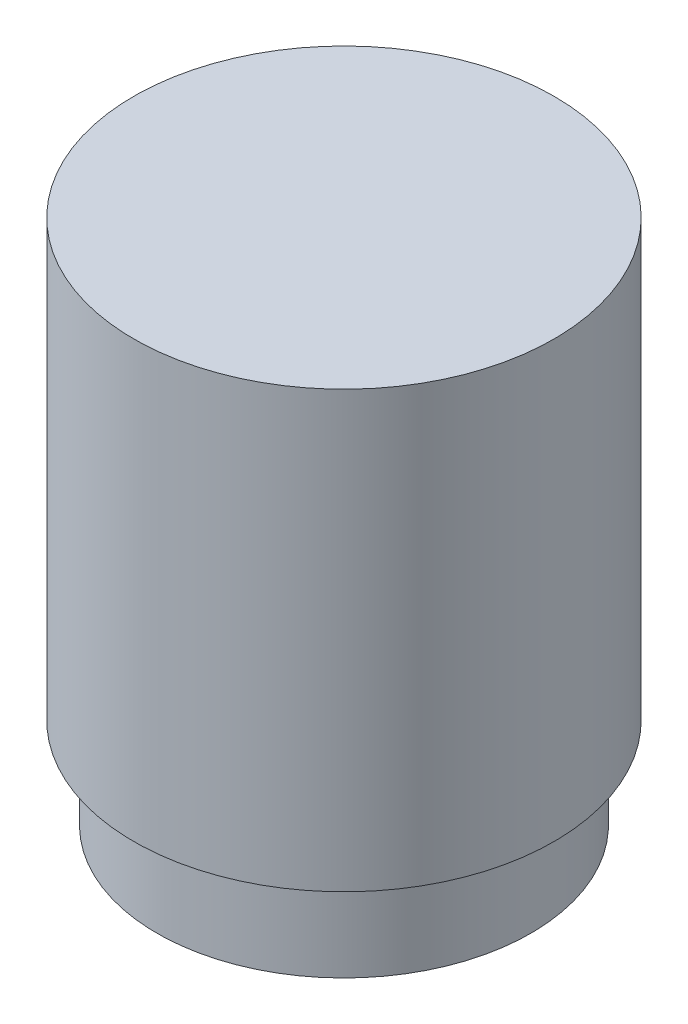
ISO-10303-21;
HEADER;
FILE_DESCRIPTION(('STEP AP214'),'2;1');
FILE_NAME('part.step','',(''),(''),'','','');
FILE_SCHEMA(('AUTOMOTIVE_DESIGN { 1 0 10303 214 1 1 1 1 }'));
ENDSEC;
DATA;
#1=APPLICATION_CONTEXT('core data for automotive mechanical design processes');
#2=APPLICATION_PROTOCOL_DEFINITION('international standard','automotive_design',2000,#1);
#3=PRODUCT_CONTEXT('',#1,'mechanical');
#4=PRODUCT('Part','Part','',(#3));
#5=PRODUCT_RELATED_PRODUCT_CATEGORY('part','',(#4));
#6=PRODUCT_DEFINITION_FORMATION('','',#4);
#7=PRODUCT_DEFINITION_CONTEXT('part definition',#1,'design');
#8=PRODUCT_DEFINITION('design','',#6,#7);
#9=PRODUCT_DEFINITION_SHAPE('','',#8);
#10=(LENGTH_UNIT() NAMED_UNIT(*) SI_UNIT(.MILLI.,.METRE.));
#11=(NAMED_UNIT(*) PLANE_ANGLE_UNIT() SI_UNIT($,.RADIAN.));
#12=(NAMED_UNIT(*) SI_UNIT($,.STERADIAN.) SOLID_ANGLE_UNIT());
#13=UNCERTAINTY_MEASURE_WITH_UNIT(LENGTH_MEASURE(1.E-05),#10,'distance_accuracy_value','');
#14=(GEOMETRIC_REPRESENTATION_CONTEXT(3) GLOBAL_UNCERTAINTY_ASSIGNED_CONTEXT((#13)) GLOBAL_UNIT_ASSIGNED_CONTEXT((#10,
#11,#12)) REPRESENTATION_CONTEXT('',''));
#15=CARTESIAN_POINT('',(0.,0.,0.));
#16=DIRECTION('',(0.,0.,1.));
#17=DIRECTION('',(1.,0.,0.));
#18=AXIS2_PLACEMENT_3D('',#15,#16,#17);
#19=CARTESIAN_POINT('',(0.,0.,0.));
#20=DIRECTION('',(0.,-1.,0.));
#21=DIRECTION('',(0.,0.,-1.));
#22=AXIS2_PLACEMENT_3D('',#19,#20,#21);
#23=CYLINDRICAL_SURFACE('',#22,3.);
#24=CARTESIAN_POINT('',(0.,13.46,0.));
#25=DIRECTION('',(0.,-1.,0.));
#26=DIRECTION('',(0.,0.,-1.));
#27=AXIS2_PLACEMENT_3D('',#24,#25,#26);
#28=CIRCLE('',#27,3.);
#29=CARTESIAN_POINT('',(0.,13.46,-3.));
#30=VERTEX_POINT('',#29);
#31=EDGE_CURVE('E72',#30,#30,#28,.T.);
#32=ORIENTED_EDGE('',*,*,#31,.F.);
#33=EDGE_LOOP('',(#32));
#34=FACE_BOUND('',#33,.T.);
#35=CARTESIAN_POINT('',(0.,4.,0.));
#36=DIRECTION('',(0.,-1.,0.));
#37=DIRECTION('',(0.,0.,-1.));
#38=AXIS2_PLACEMENT_3D('',#35,#36,#37);
#39=CIRCLE('',#38,3.);
#40=CARTESIAN_POINT('',(0.,4.,-3.));
#41=VERTEX_POINT('',#40);
#42=EDGE_CURVE('E10',#41,#41,#39,.T.);
#43=ORIENTED_EDGE('',*,*,#42,.T.);
#44=EDGE_LOOP('',(#43));
#45=FACE_BOUND('',#44,.T.);
#46=ADVANCED_FACE('F37',(#34,#45),#23,.F.);
#47=CARTESIAN_POINT('',(0.,4.,3.));
#48=DIRECTION('',(0.,1.,0.));
#49=DIRECTION('',(0.,0.,1.));
#50=AXIS2_PLACEMENT_3D('',#47,#48,#49);
#51=PLANE('',#50);
#52=ORIENTED_EDGE('',*,*,#42,.F.);
#53=EDGE_LOOP('',(#52));
#54=FACE_BOUND('',#53,.T.);
#55=CARTESIAN_POINT('',(0.,4.,0.));
#56=DIRECTION('',(0.,-1.,0.));
#57=DIRECTION('',(0.,0.,-1.));
#58=AXIS2_PLACEMENT_3D('',#55,#56,#57);
#59=CIRCLE('',#58,4.75);
#60=CARTESIAN_POINT('',(0.,4.,-4.75));
#61=VERTEX_POINT('',#60);
#62=EDGE_CURVE('E44',#61,#61,#59,.T.);
#63=ORIENTED_EDGE('',*,*,#62,.T.);
#64=EDGE_LOOP('',(#63));
#65=FACE_BOUND('',#64,.T.);
#66=ADVANCED_FACE('F80',(#54,#65),#51,.F.);
#67=CARTESIAN_POINT('',(0.,0.,0.));
#68=DIRECTION('',(0.,-1.,0.));
#69=DIRECTION('',(0.,0.,-1.));
#70=AXIS2_PLACEMENT_3D('',#67,#68,#69);
#71=CYLINDRICAL_SURFACE('',#70,4.75);
#72=ORIENTED_EDGE('',*,*,#62,.F.);
#73=EDGE_LOOP('',(#72));
#74=FACE_BOUND('',#73,.T.);
#75=CARTESIAN_POINT('',(0.,0.,0.));
#76=DIRECTION('',(0.,-1.,0.));
#77=DIRECTION('',(0.,0.,-1.));
#78=AXIS2_PLACEMENT_3D('',#75,#76,#77);
#79=CIRCLE('',#78,4.75);
#80=CARTESIAN_POINT('',(0.,0.,-4.75));
#81=VERTEX_POINT('',#80);
#82=EDGE_CURVE('E49',#81,#81,#79,.T.);
#83=ORIENTED_EDGE('',*,*,#82,.T.);
#84=EDGE_LOOP('',(#83));
#85=FACE_BOUND('',#84,.T.);
#86=ADVANCED_FACE('F84',(#74,#85),#71,.F.);
#87=CARTESIAN_POINT('',(0.,0.,4.75));
#88=DIRECTION('',(0.,1.,0.));
#89=DIRECTION('',(0.,0.,1.));
#90=AXIS2_PLACEMENT_3D('',#87,#88,#89);
#91=PLANE('',#90);
#92=ORIENTED_EDGE('',*,*,#82,.F.);
#93=EDGE_LOOP('',(#92));
#94=FACE_BOUND('',#93,.T.);
#95=CARTESIAN_POINT('',(0.,0.,0.));
#96=DIRECTION('',(0.,-1.,0.));
#97=DIRECTION('',(0.,0.,-1.));
#98=AXIS2_PLACEMENT_3D('',#95,#96,#97);
#99=CIRCLE('',#98,5.65);
#100=CARTESIAN_POINT('',(0.,0.,-5.65));
#101=VERTEX_POINT('',#100);
#102=EDGE_CURVE('E54',#101,#101,#99,.T.);
#103=ORIENTED_EDGE('',*,*,#102,.T.);
#104=EDGE_LOOP('',(#103));
#105=FACE_BOUND('',#104,.T.);
#106=ADVANCED_FACE('F89',(#94,#105),#91,.F.);
#107=CARTESIAN_POINT('',(0.,0.,0.));
#108=DIRECTION('',(0.,-1.,0.));
#109=DIRECTION('',(0.,0.,-1.));
#110=AXIS2_PLACEMENT_3D('',#107,#108,#109);
#111=CYLINDRICAL_SURFACE('',#110,5.65);
#112=ORIENTED_EDGE('',*,*,#102,.F.);
#113=EDGE_LOOP('',(#112));
#114=FACE_BOUND('',#113,.T.);
#115=CARTESIAN_POINT('',(0.,2.75,0.));
#116=DIRECTION('',(0.,-1.,0.));
#117=DIRECTION('',(0.,0.,-1.));
#118=AXIS2_PLACEMENT_3D('',#115,#116,#117);
#119=CIRCLE('',#118,5.65);
#120=CARTESIAN_POINT('',(0.,2.75,-5.65));
#121=VERTEX_POINT('',#120);
#122=EDGE_CURVE('E60',#121,#121,#119,.T.);
#123=ORIENTED_EDGE('',*,*,#122,.T.);
#124=EDGE_LOOP('',(#123));
#125=FACE_BOUND('',#124,.T.);
#126=ADVANCED_FACE('F95',(#114,#125),#111,.T.);
#127=CARTESIAN_POINT('',(0.,2.75,5.65));
#128=DIRECTION('',(0.,1.,0.));
#129=DIRECTION('',(0.,0.,1.));
#130=AXIS2_PLACEMENT_3D('',#127,#128,#129);
#131=PLANE('',#130);
#132=ORIENTED_EDGE('',*,*,#122,.F.);
#133=EDGE_LOOP('',(#132));
#134=FACE_BOUND('',#133,.T.);
#135=CARTESIAN_POINT('',(0.,2.75,0.));
#136=DIRECTION('',(0.,-1.,0.));
#137=DIRECTION('',(0.,0.,-1.));
#138=AXIS2_PLACEMENT_3D('',#135,#136,#137);
#139=CIRCLE('',#138,6.35);
#140=CARTESIAN_POINT('',(0.,2.75,-6.35));
#141=VERTEX_POINT('',#140);
#142=EDGE_CURVE('E64',#141,#141,#139,.T.);
#143=ORIENTED_EDGE('',*,*,#142,.T.);
#144=EDGE_LOOP('',(#143));
#145=FACE_BOUND('',#144,.T.);
#146=ADVANCED_FACE('F99',(#134,#145),#131,.F.);
#147=CARTESIAN_POINT('',(0.,0.,0.));
#148=DIRECTION('',(0.,-1.,0.));
#149=DIRECTION('',(0.,0.,-1.));
#150=AXIS2_PLACEMENT_3D('',#147,#148,#149);
#151=CYLINDRICAL_SURFACE('',#150,6.35);
#152=ORIENTED_EDGE('',*,*,#142,.F.);
#153=EDGE_LOOP('',(#152));
#154=FACE_BOUND('',#153,.T.);
#155=CARTESIAN_POINT('',(0.,15.9,0.));
#156=DIRECTION('',(0.,-1.,0.));
#157=DIRECTION('',(0.,0.,-1.));
#158=AXIS2_PLACEMENT_3D('',#155,#156,#157);
#159=CIRCLE('',#158,6.35);
#160=CARTESIAN_POINT('',(0.,15.9,-6.35));
#161=VERTEX_POINT('',#160);
#162=EDGE_CURVE('E68',#161,#161,#159,.T.);
#163=ORIENTED_EDGE('',*,*,#162,.T.);
#164=EDGE_LOOP('',(#163));
#165=FACE_BOUND('',#164,.T.);
#166=ADVANCED_FACE('F103',(#154,#165),#151,.T.);
#167=CARTESIAN_POINT('',(0.,15.9,6.35));
#168=DIRECTION('',(0.,-1.,0.));
#169=DIRECTION('',(0.,0.,-1.));
#170=AXIS2_PLACEMENT_3D('',#167,#168,#169);
#171=PLANE('',#170);
#172=ORIENTED_EDGE('',*,*,#162,.F.);
#173=EDGE_LOOP('',(#172));
#174=FACE_BOUND('',#173,.T.);
#175=ADVANCED_FACE('F107',(#174),#171,.F.);
#176=CARTESIAN_POINT('',(0.,13.46,0.));
#177=DIRECTION('',(0.,1.,0.));
#178=DIRECTION('',(0.,0.,1.));
#179=AXIS2_PLACEMENT_3D('',#176,#177,#178);
#180=PLANE('',#179);
#181=ORIENTED_EDGE('',*,*,#31,.T.);
#182=EDGE_LOOP('',(#181));
#183=FACE_BOUND('',#182,.T.);
#184=ADVANCED_FACE('F77',(#183),#180,.F.);
#185=CLOSED_SHELL('',(#46,#66,#86,#106,#126,#146,#166,#175,#184));
#186=MANIFOLD_SOLID_BREP('B2',#185);
#187=ADVANCED_BREP_SHAPE_REPRESENTATION('',(#18,#186),#14);
#188=SHAPE_DEFINITION_REPRESENTATION(#9,#187);
ENDSEC;
END-ISO-10303-21;
